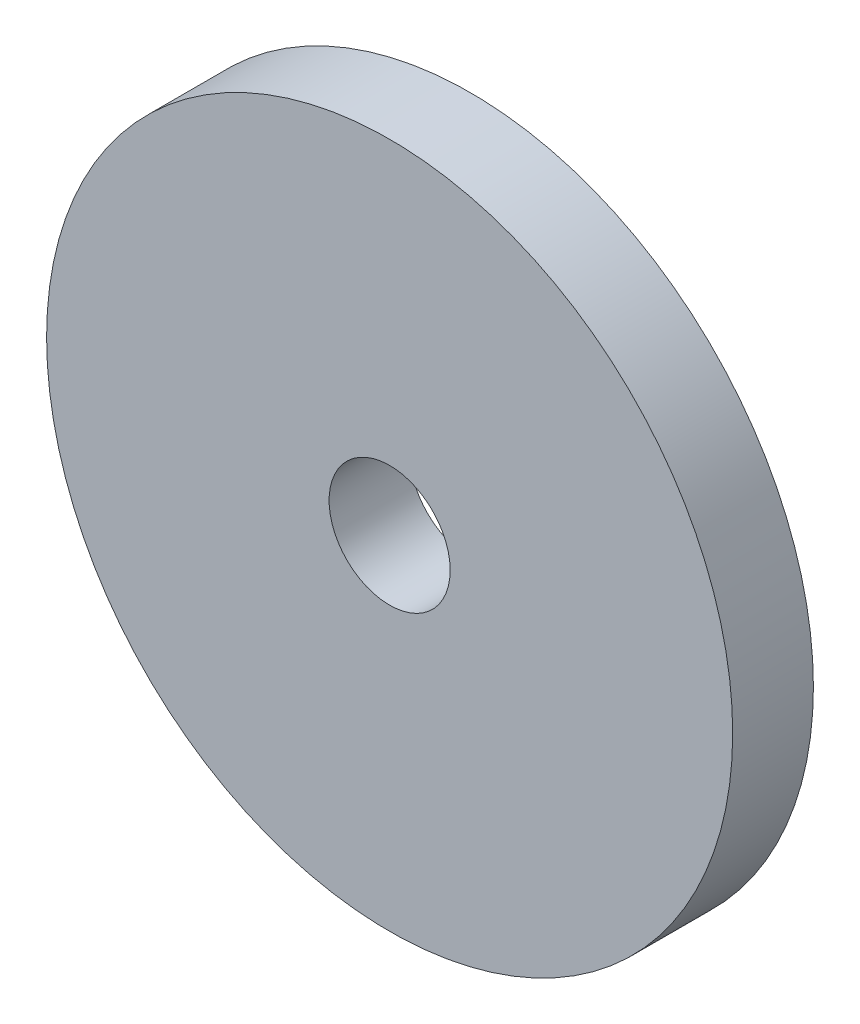
ISO-10303-21;
HEADER;
FILE_DESCRIPTION(('STEP AP214'),'2;1');
FILE_NAME('part.step','',(''),(''),'','','');
FILE_SCHEMA(('AUTOMOTIVE_DESIGN { 1 0 10303 214 1 1 1 1 }'));
ENDSEC;
DATA;
#1=APPLICATION_CONTEXT('core data for automotive mechanical design processes');
#2=APPLICATION_PROTOCOL_DEFINITION('international standard','automotive_design',2000,#1);
#3=PRODUCT_CONTEXT('',#1,'mechanical');
#4=PRODUCT('Part','Part','',(#3));
#5=PRODUCT_RELATED_PRODUCT_CATEGORY('part','',(#4));
#6=PRODUCT_DEFINITION_FORMATION('','',#4);
#7=PRODUCT_DEFINITION_CONTEXT('part definition',#1,'design');
#8=PRODUCT_DEFINITION('design','',#6,#7);
#9=PRODUCT_DEFINITION_SHAPE('','',#8);
#10=(LENGTH_UNIT() NAMED_UNIT(*) SI_UNIT(.MILLI.,.METRE.));
#11=(NAMED_UNIT(*) PLANE_ANGLE_UNIT() SI_UNIT($,.RADIAN.));
#12=(NAMED_UNIT(*) SI_UNIT($,.STERADIAN.) SOLID_ANGLE_UNIT());
#13=UNCERTAINTY_MEASURE_WITH_UNIT(LENGTH_MEASURE(1.E-05),#10,'distance_accuracy_value','');
#14=(GEOMETRIC_REPRESENTATION_CONTEXT(3) GLOBAL_UNCERTAINTY_ASSIGNED_CONTEXT((#13)) GLOBAL_UNIT_ASSIGNED_CONTEXT((#10,
#11,#12)) REPRESENTATION_CONTEXT('',''));
#15=CARTESIAN_POINT('',(0.,0.,0.));
#16=DIRECTION('',(0.,0.,1.));
#17=DIRECTION('',(1.,0.,0.));
#18=AXIS2_PLACEMENT_3D('',#15,#16,#17);
#19=CARTESIAN_POINT('',(19.7500030667433,9.99999803628092,4.));
#20=DIRECTION('',(0.,0.,1.));
#21=DIRECTION('',(1.,0.,0.));
#22=AXIS2_PLACEMENT_3D('',#19,#20,#21);
#23=PLANE('',#22);
#24=CARTESIAN_POINT('',(19.7500030667433,9.99999803628092,4.));
#25=DIRECTION('',(0.,0.,1.));
#26=DIRECTION('',(1.,0.,0.));
#27=AXIS2_PLACEMENT_3D('',#24,#25,#26);
#28=CIRCLE('',#27,17.);
#29=CARTESIAN_POINT('',(36.7500030667433,9.99999803628092,4.));
#30=VERTEX_POINT('',#29);
#31=EDGE_CURVE('E10',#30,#30,#28,.T.);
#32=ORIENTED_EDGE('',*,*,#31,.T.);
#33=EDGE_LOOP('',(#32));
#34=FACE_BOUND('',#33,.T.);
#35=CARTESIAN_POINT('',(19.7500030667433,9.99999803628092,4.));
#36=DIRECTION('',(0.,0.,1.));
#37=DIRECTION('',(1.,0.,0.));
#38=AXIS2_PLACEMENT_3D('',#35,#36,#37);
#39=CIRCLE('',#38,3.);
#40=CARTESIAN_POINT('',(22.7500030667433,9.99999803628092,4.));
#41=VERTEX_POINT('',#40);
#42=EDGE_CURVE('E41',#41,#41,#39,.T.);
#43=ORIENTED_EDGE('',*,*,#42,.F.);
#44=EDGE_LOOP('',(#43));
#45=FACE_BOUND('',#44,.T.);
#46=ADVANCED_FACE('F30',(#34,#45),#23,.T.);
#47=CARTESIAN_POINT('',(19.7500030667433,9.99999803628092,0.));
#48=DIRECTION('',(0.,0.,1.));
#49=DIRECTION('',(1.,0.,0.));
#50=AXIS2_PLACEMENT_3D('',#47,#48,#49);
#51=PLANE('',#50);
#52=CARTESIAN_POINT('',(19.7500030667433,9.99999803628092,0.));
#53=DIRECTION('',(0.,0.,1.));
#54=DIRECTION('',(1.,0.,0.));
#55=AXIS2_PLACEMENT_3D('',#52,#53,#54);
#56=CIRCLE('',#55,17.);
#57=CARTESIAN_POINT('',(36.7500030667433,9.99999803628092,0.));
#58=VERTEX_POINT('',#57);
#59=EDGE_CURVE('E34',#58,#58,#56,.T.);
#60=ORIENTED_EDGE('',*,*,#59,.F.);
#61=EDGE_LOOP('',(#60));
#62=FACE_BOUND('',#61,.T.);
#63=CARTESIAN_POINT('',(19.7500030667433,9.99999803628092,0.));
#64=DIRECTION('',(0.,0.,1.));
#65=DIRECTION('',(1.,0.,0.));
#66=AXIS2_PLACEMENT_3D('',#63,#64,#65);
#67=CIRCLE('',#66,3.);
#68=CARTESIAN_POINT('',(22.7500030667433,9.99999803628092,0.));
#69=VERTEX_POINT('',#68);
#70=EDGE_CURVE('E43',#69,#69,#67,.T.);
#71=ORIENTED_EDGE('',*,*,#70,.T.);
#72=EDGE_LOOP('',(#71));
#73=FACE_BOUND('',#72,.T.);
#74=ADVANCED_FACE('F53',(#62,#73),#51,.F.);
#75=CARTESIAN_POINT('',(19.7500030667433,9.99999803628092,4.));
#76=DIRECTION('',(0.,0.,-1.));
#77=DIRECTION('',(-1.,0.,0.));
#78=AXIS2_PLACEMENT_3D('',#75,#76,#77);
#79=CYLINDRICAL_SURFACE('',#78,17.);
#80=ORIENTED_EDGE('',*,*,#31,.F.);
#81=EDGE_LOOP('',(#80));
#82=FACE_BOUND('',#81,.T.);
#83=ORIENTED_EDGE('',*,*,#59,.T.);
#84=EDGE_LOOP('',(#83));
#85=FACE_BOUND('',#84,.T.);
#86=ADVANCED_FACE('F32',(#82,#85),#79,.T.);
#87=CARTESIAN_POINT('',(19.7500030667433,9.99999803628092,4.));
#88=DIRECTION('',(0.,0.,-1.));
#89=DIRECTION('',(-1.,0.,0.));
#90=AXIS2_PLACEMENT_3D('',#87,#88,#89);
#91=CYLINDRICAL_SURFACE('',#90,3.);
#92=ORIENTED_EDGE('',*,*,#42,.T.);
#93=EDGE_LOOP('',(#92));
#94=FACE_BOUND('',#93,.T.);
#95=ORIENTED_EDGE('',*,*,#70,.F.);
#96=EDGE_LOOP('',(#95));
#97=FACE_BOUND('',#96,.T.);
#98=ADVANCED_FACE('F49',(#94,#97),#91,.F.);
#99=CLOSED_SHELL('',(#46,#74,#86,#98));
#100=MANIFOLD_SOLID_BREP('B2',#99);
#101=ADVANCED_BREP_SHAPE_REPRESENTATION('',(#18,#100),#14);
#102=SHAPE_DEFINITION_REPRESENTATION(#9,#101);
ENDSEC;
END-ISO-10303-21;
